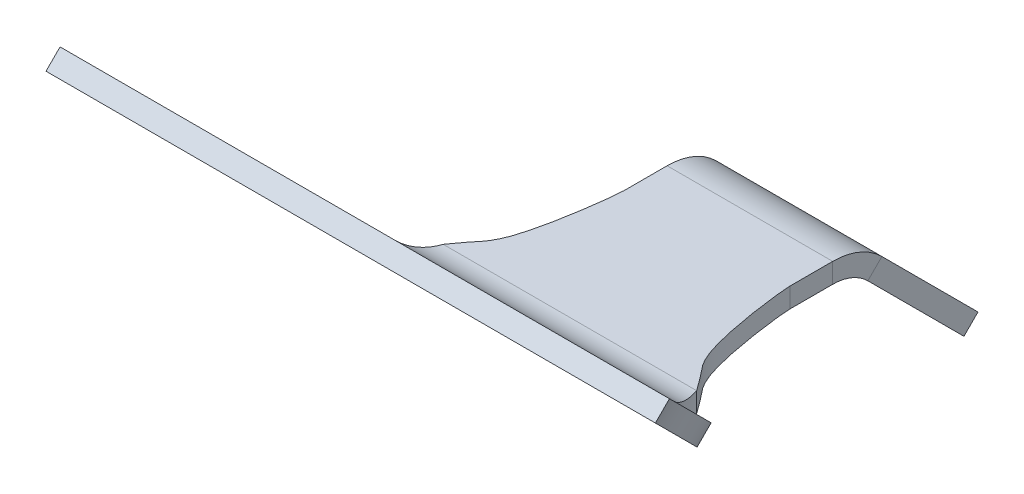
ISO-10303-21;
HEADER;
FILE_DESCRIPTION(('STEP AP214'),'2;1');
FILE_NAME('part.step','',(''),(''),'','','');
FILE_SCHEMA(('AUTOMOTIVE_DESIGN { 1 0 10303 214 1 1 1 1 }'));
ENDSEC;
DATA;
#1=APPLICATION_CONTEXT('core data for automotive mechanical design processes');
#2=APPLICATION_PROTOCOL_DEFINITION('international standard','automotive_design',2000,#1);
#3=PRODUCT_CONTEXT('',#1,'mechanical');
#4=PRODUCT('Part','Part','',(#3));
#5=PRODUCT_RELATED_PRODUCT_CATEGORY('part','',(#4));
#6=PRODUCT_DEFINITION_FORMATION('','',#4);
#7=PRODUCT_DEFINITION_CONTEXT('part definition',#1,'design');
#8=PRODUCT_DEFINITION('design','',#6,#7);
#9=PRODUCT_DEFINITION_SHAPE('','',#8);
#10=(LENGTH_UNIT() NAMED_UNIT(*) SI_UNIT(.MILLI.,.METRE.));
#11=(NAMED_UNIT(*) PLANE_ANGLE_UNIT() SI_UNIT($,.RADIAN.));
#12=(NAMED_UNIT(*) SI_UNIT($,.STERADIAN.) SOLID_ANGLE_UNIT());
#13=UNCERTAINTY_MEASURE_WITH_UNIT(LENGTH_MEASURE(1.E-05),#10,'distance_accuracy_value','');
#14=(GEOMETRIC_REPRESENTATION_CONTEXT(3) GLOBAL_UNCERTAINTY_ASSIGNED_CONTEXT((#13)) GLOBAL_UNIT_ASSIGNED_CONTEXT((#10,
#11,#12)) REPRESENTATION_CONTEXT('',''));
#15=CARTESIAN_POINT('',(0.,0.,0.));
#16=DIRECTION('',(0.,0.,1.));
#17=DIRECTION('',(1.,0.,0.));
#18=AXIS2_PLACEMENT_3D('',#15,#16,#17);
#19=CARTESIAN_POINT('',(12.5,15.1311802483163,-12.6305469640361));
#20=DIRECTION('',(1.,0.,0.));
#21=DIRECTION('',(0.,0.,1.));
#22=AXIS2_PLACEMENT_3D('',#19,#20,#21);
#23=PLANE('',#22);
#24=DIRECTION('',(0.,0.,1.));
#25=VECTOR('',#24,1.);
#26=CARTESIAN_POINT('',(12.5,12.1311802483163,-12.6305469640361));
#27=LINE('',#26,#25);
#28=CARTESIAN_POINT('',(12.5,12.1311802483163,-19.1098316195848));
#29=VERTEX_POINT('',#28);
#30=CARTESIAN_POINT('',(12.5,12.1311802483163,-12.6305469640361));
#31=VERTEX_POINT('',#30);
#32=EDGE_CURVE('E193',#29,#31,#27,.T.);
#33=ORIENTED_EDGE('',*,*,#32,.F.);
#34=DIRECTION('',(0.,1.,0.));
#35=VECTOR('',#34,1.);
#36=CARTESIAN_POINT('',(12.5,15.1311802483163,-19.1098316195848));
#37=LINE('',#36,#35);
#38=CARTESIAN_POINT('',(12.5,15.1311802483163,-19.1098316195847));
#39=VERTEX_POINT('',#38);
#40=EDGE_CURVE('E171',#29,#39,#37,.T.);
#41=ORIENTED_EDGE('',*,*,#40,.T.);
#42=DIRECTION('',(0.,0.,1.));
#43=VECTOR('',#42,1.);
#44=CARTESIAN_POINT('',(12.5,15.1311802483163,-12.6305469640361));
#45=LINE('',#44,#43);
#46=CARTESIAN_POINT('',(12.5,15.1311802483163,-12.6305469640361));
#47=VERTEX_POINT('',#46);
#48=EDGE_CURVE('E63',#39,#47,#45,.T.);
#49=ORIENTED_EDGE('',*,*,#48,.T.);
#50=DIRECTION('',(0.,-1.,0.));
#51=VECTOR('',#50,1.);
#52=CARTESIAN_POINT('',(12.5,15.1311802483163,-12.6305469640361));
#53=LINE('',#52,#51);
#54=EDGE_CURVE('E201',#47,#31,#53,.T.);
#55=ORIENTED_EDGE('',*,*,#54,.T.);
#56=EDGE_LOOP('',(#33,#41,#49,#55));
#57=FACE_BOUND('',#56,.T.);
#58=ADVANCED_FACE('F59',(#57),#23,.T.);
#59=CARTESIAN_POINT('',(-12.5,15.1311802483163,-12.6305469640361));
#60=DIRECTION('',(-1.,0.,0.));
#61=DIRECTION('',(0.,0.,-1.));
#62=AXIS2_PLACEMENT_3D('',#59,#60,#61);
#63=PLANE('',#62);
#64=DIRECTION('',(0.,0.,-1.));
#65=VECTOR('',#64,1.);
#66=CARTESIAN_POINT('',(-12.5,15.1311802483163,-12.6305469640361));
#67=LINE('',#66,#65);
#68=CARTESIAN_POINT('',(-12.5,15.1311802483163,-12.6305469640361));
#69=VERTEX_POINT('',#68);
#70=CARTESIAN_POINT('',(-12.5,15.1311802483163,-19.1098316195848));
#71=VERTEX_POINT('',#70);
#72=EDGE_CURVE('E199',#69,#71,#67,.T.);
#73=ORIENTED_EDGE('',*,*,#72,.T.);
#74=DIRECTION('',(0.,-1.,0.));
#75=VECTOR('',#74,1.);
#76=CARTESIAN_POINT('',(-12.5,15.1311802483163,-19.1098316195848));
#77=LINE('',#76,#75);
#78=CARTESIAN_POINT('',(-12.5,12.1311802483163,-19.1098316195848));
#79=VERTEX_POINT('',#78);
#80=EDGE_CURVE('E12',#71,#79,#77,.T.);
#81=ORIENTED_EDGE('',*,*,#80,.T.);
#82=DIRECTION('',(0.,0.,-1.));
#83=VECTOR('',#82,1.);
#84=CARTESIAN_POINT('',(-12.5,12.1311802483163,-12.6305469640361));
#85=LINE('',#84,#83);
#86=CARTESIAN_POINT('',(-12.5,12.1311802483163,-12.6305469640361));
#87=VERTEX_POINT('',#86);
#88=EDGE_CURVE('E191',#87,#79,#85,.T.);
#89=ORIENTED_EDGE('',*,*,#88,.F.);
#90=DIRECTION('',(0.,-1.,0.));
#91=VECTOR('',#90,1.);
#92=CARTESIAN_POINT('',(-12.5,15.1311802483163,-12.6305469640361));
#93=LINE('',#92,#91);
#94=EDGE_CURVE('E334',#69,#87,#93,.T.);
#95=ORIENTED_EDGE('',*,*,#94,.F.);
#96=EDGE_LOOP('',(#73,#81,#89,#95));
#97=FACE_BOUND('',#96,.T.);
#98=ADVANCED_FACE('F61',(#97),#63,.T.);
#99=CARTESIAN_POINT('',(-27.660317627681,15.1311802483161,20.0813559891));
#100=DIRECTION('',(0.,1.,0.));
#101=DIRECTION('',(-1.,0.,0.));
#102=AXIS2_PLACEMENT_3D('',#99,#100,#101);
#103=PLANE('',#102);
#104=ORIENTED_EDGE('',*,*,#48,.F.);
#105=DIRECTION('',(-1.,0.,0.));
#106=VECTOR('',#105,1.);
#107=CARTESIAN_POINT('',(-27.660317627681,15.1311802483163,-19.1098316195848));
#108=LINE('',#107,#106);
#109=EDGE_CURVE('E163',#39,#71,#108,.T.);
#110=ORIENTED_EDGE('',*,*,#109,.T.);
#111=ORIENTED_EDGE('',*,*,#72,.F.);
#112=CARTESIAN_POINT('',(-46.,15.131180248316,47.369453035964));
#113=CARTESIAN_POINT('',(-41.2195604310823,15.131180248316,38.5307724819687));
#114=CARTESIAN_POINT('',(-41.5910175016558,15.1311802483161,26.9984495535955));
#115=CARTESIAN_POINT('',(-25.7021633373936,15.1311802483161,21.4414873090519));
#116=CARTESIAN_POINT('',(-21.2965224131741,15.1311802483162,9.74072410555167));
#117=CARTESIAN_POINT('',(-14.2557252648445,15.1311802483162,2.2860798987868));
#118=CARTESIAN_POINT('',(-12.5756166060138,15.1311802483163,-10.264528004786));
#119=CARTESIAN_POINT('',(-12.5,15.1311802483163,-12.6305469640361));
#120=B_SPLINE_CURVE_WITH_KNOTS('',3,(#112,#113,#114,#115,#116,#117,#118,#119),.UNSPECIFIED.,.F.,
.F.,(4,1,1,1,1,4),(0.,0.326235686639177,0.410817953526189,0.797488811609687,0.861240401983112,
1.),.UNSPECIFIED.);
#121=CARTESIAN_POINT('',(-19.1339481414061,15.1311802414496,8.06630903878126));
#122=VERTEX_POINT('',#121);
#123=EDGE_CURVE('E202',#122,#69,#120,.T.);
#124=ORIENTED_EDGE('',*,*,#123,.F.);
#125=DIRECTION('',(-1.,0.,0.));
#126=VECTOR('',#125,1.);
#127=CARTESIAN_POINT('',(-27.660317627681,15.1311802483162,8.06630901686981));
#128=LINE('',#127,#126);
#129=CARTESIAN_POINT('',(19.1339481414307,15.1311802483162,8.0663090266165));
#130=VERTEX_POINT('',#129);
#131=EDGE_CURVE('E330',#130,#122,#128,.T.);
#132=ORIENTED_EDGE('',*,*,#131,.F.);
#133=CARTESIAN_POINT('',(12.5,15.1311802483163,-12.6305469640361));
#134=CARTESIAN_POINT('',(12.5756166060138,15.1311802483163,-10.264528004786));
#135=CARTESIAN_POINT('',(14.2557252648445,15.1311802483162,2.2860798987868));
#136=CARTESIAN_POINT('',(21.2965224131741,15.1311802483162,9.74072410555167));
#137=CARTESIAN_POINT('',(25.7021633373936,15.1311802483161,21.4414873090519));
#138=CARTESIAN_POINT('',(41.5910175016558,15.1311802483161,26.9984495535955));
#139=CARTESIAN_POINT('',(41.2195604310823,15.131180248316,38.5307724819687));
#140=CARTESIAN_POINT('',(46.,15.131180248316,47.369453035964));
#141=B_SPLINE_CURVE_WITH_KNOTS('',3,(#133,#134,#135,#136,#137,#138,#139,#140),.UNSPECIFIED.,.F.,
.F.,(4,1,1,1,1,4),(0.,0.138759598016888,0.202511188390313,0.589182046473811,0.673764313360823,
1.),.UNSPECIFIED.);
#142=EDGE_CURVE('E187',#47,#130,#141,.T.);
#143=ORIENTED_EDGE('',*,*,#142,.F.);
#144=EDGE_LOOP('',(#104,#110,#111,#124,#132,#143));
#145=FACE_BOUND('',#144,.T.);
#146=ADVANCED_FACE('F185',(#145),#103,.T.);
#147=CARTESIAN_POINT('',(-27.660317627681,12.1311802483161,20.0813559890999));
#148=DIRECTION('',(0.,1.,0.));
#149=DIRECTION('',(-1.,0.,0.));
#150=AXIS2_PLACEMENT_3D('',#147,#148,#149);
#151=PLANE('',#150);
#152=DIRECTION('',(-1.,0.,0.));
#153=VECTOR('',#152,1.);
#154=CARTESIAN_POINT('',(-27.660317627681,12.1311802483163,-19.1098316195848));
#155=LINE('',#154,#153);
#156=EDGE_CURVE('E68',#29,#79,#155,.T.);
#157=ORIENTED_EDGE('',*,*,#156,.F.);
#158=ORIENTED_EDGE('',*,*,#32,.T.);
#159=CARTESIAN_POINT('',(12.5,12.1311802483163,-12.6305469640361));
#160=CARTESIAN_POINT('',(12.5756166060138,12.1311802483163,-10.264528004786));
#161=CARTESIAN_POINT('',(14.2557252648445,12.1311802483162,2.28607989878678));
#162=CARTESIAN_POINT('',(21.2965224131741,12.1311802483162,9.74072410555166));
#163=CARTESIAN_POINT('',(25.7021633373936,12.1311802483161,21.4414873090518));
#164=CARTESIAN_POINT('',(41.5910175016558,12.1311802483161,26.9984495535955));
#165=CARTESIAN_POINT('',(41.2195604310823,12.131180248316,38.5307724819687));
#166=CARTESIAN_POINT('',(46.,12.131180248316,47.369453035964));
#167=B_SPLINE_CURVE_WITH_KNOTS('',3,(#159,#160,#161,#162,#163,#164,#165,#166),.UNSPECIFIED.,.F.,
.F.,(4,1,1,1,1,4),(0.,0.138759598016888,0.202511188390313,0.589182046473811,0.673764313360823,
1.),.UNSPECIFIED.);
#168=CARTESIAN_POINT('',(19.1339481414307,12.1311802483162,8.06630902661649));
#169=VERTEX_POINT('',#168);
#170=EDGE_CURVE('E84',#31,#169,#167,.T.);
#171=ORIENTED_EDGE('',*,*,#170,.T.);
#172=DIRECTION('',(-1.,0.,0.));
#173=VECTOR('',#172,1.);
#174=CARTESIAN_POINT('',(-27.660317627681,12.1311802483162,8.06630901686979));
#175=LINE('',#174,#173);
#176=CARTESIAN_POINT('',(-19.1339481414061,12.1311802483162,8.06630902658065));
#177=VERTEX_POINT('',#176);
#178=EDGE_CURVE('E345',#169,#177,#175,.T.);
#179=ORIENTED_EDGE('',*,*,#178,.T.);
#180=CARTESIAN_POINT('',(-46.,12.131180248316,47.369453035964));
#181=CARTESIAN_POINT('',(-41.2195604310823,12.131180248316,38.5307724819687));
#182=CARTESIAN_POINT('',(-41.5910175016558,12.1311802483161,26.9984495535954));
#183=CARTESIAN_POINT('',(-25.7021633373936,12.1311802483161,21.4414873090518));
#184=CARTESIAN_POINT('',(-21.2965224131741,12.1311802483162,9.74072410555166));
#185=CARTESIAN_POINT('',(-14.2557252648445,12.1311802483162,2.28607989878679));
#186=CARTESIAN_POINT('',(-12.5756166060138,12.1311802483163,-10.264528004786));
#187=CARTESIAN_POINT('',(-12.5,12.1311802483163,-12.6305469640361));
#188=B_SPLINE_CURVE_WITH_KNOTS('',3,(#180,#181,#182,#183,#184,#185,#186,#187),.UNSPECIFIED.,.F.,
.F.,(4,1,1,1,1,4),(0.,0.326235686639177,0.410817953526189,0.797488811609687,0.861240401983112,
1.),.UNSPECIFIED.);
#189=EDGE_CURVE('E204',#177,#87,#188,.T.);
#190=ORIENTED_EDGE('',*,*,#189,.T.);
#191=ORIENTED_EDGE('',*,*,#88,.T.);
#192=EDGE_LOOP('',(#157,#158,#171,#179,#190,#191));
#193=FACE_BOUND('',#192,.T.);
#194=ADVANCED_FACE('F311',(#193),#151,.F.);
#195=DIRECTION('',(0.,-1.,0.));
#196=VECTOR('',#195,1.);
#197=SURFACE_OF_LINEAR_EXTRUSION('',#120,#196);
#198=CARTESIAN_POINT('',(-19.1339481414061,15.1311802414496,8.06630903878128));
#199=CARTESIAN_POINT('',(-19.1339481414061,12.1311802414496,8.06630904640816));
#200=B_SPLINE_CURVE_WITH_KNOTS('',1,(#198,#199),.UNSPECIFIED.,.F.,.F.,(2,2),(0.,1.),.UNSPECIFIED.);
#201=EDGE_CURVE('E333',#122,#177,#200,.T.);
#202=ORIENTED_EDGE('',*,*,#201,.F.);
#203=ORIENTED_EDGE('',*,*,#123,.T.);
#204=ORIENTED_EDGE('',*,*,#94,.T.);
#205=ORIENTED_EDGE('',*,*,#189,.F.);
#206=EDGE_LOOP('',(#202,#203,#204,#205));
#207=FACE_BOUND('',#206,.T.);
#208=ADVANCED_FACE('F305',(#207),#197,.T.);
#209=DIRECTION('',(0.,-1.,0.));
#210=VECTOR('',#209,1.);
#211=SURFACE_OF_LINEAR_EXTRUSION('',#141,#210);
#212=CARTESIAN_POINT('',(19.1339481414307,12.1311802414496,8.06630904650663));
#213=CARTESIAN_POINT('',(19.1339481414307,15.1311802414496,8.06630903885162));
#214=B_SPLINE_CURVE_WITH_KNOTS('',1,(#212,#213),.UNSPECIFIED.,.F.,.F.,(2,2),(0.,1.),.UNSPECIFIED.);
#215=EDGE_CURVE('E172',#169,#130,#214,.T.);
#216=ORIENTED_EDGE('',*,*,#215,.F.);
#217=ORIENTED_EDGE('',*,*,#170,.F.);
#218=ORIENTED_EDGE('',*,*,#54,.F.);
#219=ORIENTED_EDGE('',*,*,#142,.T.);
#220=EDGE_LOOP('',(#216,#217,#218,#219));
#221=FACE_BOUND('',#220,.T.);
#222=ADVANCED_FACE('F310',(#221),#211,.T.);
#223=CARTESIAN_POINT('',(46.,42.9980786968436,39.0398091929065));
#224=DIRECTION('',(0.,0.707106781186546,0.707106781186549));
#225=DIRECTION('',(-1.,0.,0.));
#226=AXIS2_PLACEMENT_3D('',#223,#224,#225);
#227=PLANE('',#226);
#228=DIRECTION('',(-1.,0.,0.));
#229=VECTOR('',#228,1.);
#230=CARTESIAN_POINT('',(46.,40.876758353284,41.1611295364661));
#231=LINE('',#230,#229);
#232=CARTESIAN_POINT('',(46.,40.876758353284,41.1611295364661));
#233=VERTEX_POINT('',#232);
#234=CARTESIAN_POINT('',(-46.,40.8767583532841,41.1611295364662));
#235=VERTEX_POINT('',#234);
#236=EDGE_CURVE('E222',#233,#235,#231,.T.);
#237=ORIENTED_EDGE('',*,*,#236,.F.);
#238=DIRECTION('',(0.,-0.707106781186549,0.707106781186546));
#239=VECTOR('',#238,1.);
#240=CARTESIAN_POINT('',(46.,42.9980786968436,39.0398091929065));
#241=LINE('',#240,#239);
#242=CARTESIAN_POINT('',(46.,42.9980786968436,39.0398091929065));
#243=VERTEX_POINT('',#242);
#244=EDGE_CURVE('E205',#243,#233,#241,.T.);
#245=ORIENTED_EDGE('',*,*,#244,.F.);
#246=DIRECTION('',(-1.,0.,0.));
#247=VECTOR('',#246,1.);
#248=CARTESIAN_POINT('',(46.,42.9980786968436,39.0398091929065));
#249=LINE('',#248,#247);
#250=CARTESIAN_POINT('',(-46.,42.9980786968437,39.0398091929066));
#251=VERTEX_POINT('',#250);
#252=EDGE_CURVE('E230',#243,#251,#249,.T.);
#253=ORIENTED_EDGE('',*,*,#252,.T.);
#254=DIRECTION('',(0.,-0.707106781186549,0.707106781186546));
#255=VECTOR('',#254,1.);
#256=CARTESIAN_POINT('',(-46.,42.9980786968437,39.0398091929066));
#257=LINE('',#256,#255);
#258=EDGE_CURVE('E227',#251,#235,#257,.T.);
#259=ORIENTED_EDGE('',*,*,#258,.T.);
#260=EDGE_LOOP('',(#237,#245,#253,#259));
#261=FACE_BOUND('',#260,.T.);
#262=ADVANCED_FACE('F418',(#261),#227,.T.);
#263=CARTESIAN_POINT('',(-27.660317627681,23.7024802293296,19.7442107253924));
#264=DIRECTION('',(0.,0.707106781186549,-0.707106781186546));
#265=DIRECTION('',(-1.,0.,0.));
#266=AXIS2_PLACEMENT_3D('',#263,#264,#265);
#267=PLANE('',#266);
#268=CARTESIAN_POINT('',(12.5,0.571671825650955,-3.3865976782864));
#269=CARTESIAN_POINT('',(12.5756166060138,2.24469987615263,-1.71356962778471));
#270=CARTESIAN_POINT('',(14.2557252648445,11.1193198327824,7.16105032884509));
#271=CARTESIAN_POINT('',(21.2965224131741,16.3905493027188,12.4322797987816));
#272=CARTESIAN_POINT('',(25.7021633373936,24.6642383089718,20.7059688050346));
#273=CARTESIAN_POINT('',(41.5910175016558,28.5936039948862,24.635334490949));
#274=CARTESIAN_POINT('',(41.2195604310823,36.748187740372,32.7899182364348));
#275=CARTESIAN_POINT('',(46.,42.9980786968437,39.0398091929066));
#276=B_SPLINE_CURVE_WITH_KNOTS('',3,(#268,#269,#270,#271,#272,#273,#274,#275),.UNSPECIFIED.,.F.,
.F.,(4,1,1,1,1,4),(0.,0.138759598016888,0.202511188390313,0.589182046473811,0.673764313360823,
1.),.UNSPECIFIED.);
#277=CARTESIAN_POINT('',(21.0887316402293,17.3278793825504,13.3696098786132));
#278=VERTEX_POINT('',#277);
#279=EDGE_CURVE('E208',#278,#243,#276,.T.);
#280=ORIENTED_EDGE('',*,*,#279,.F.);
#281=DIRECTION('',(-1.,0.,0.));
#282=VECTOR('',#281,1.);
#283=CARTESIAN_POINT('',(-27.660317627681,17.3278793825505,13.3696098786132));
#284=LINE('',#283,#282);
#285=CARTESIAN_POINT('',(-21.0887316402293,17.3278793825505,13.3696098786132));
#286=VERTEX_POINT('',#285);
#287=EDGE_CURVE('E229',#278,#286,#284,.T.);
#288=ORIENTED_EDGE('',*,*,#287,.T.);
#289=CARTESIAN_POINT('',(-46.,42.9980786968437,39.0398091929066));
#290=CARTESIAN_POINT('',(-41.2195604310823,36.748187740372,32.7899182364348));
#291=CARTESIAN_POINT('',(-41.5910175016558,28.5936039948862,24.635334490949));
#292=CARTESIAN_POINT('',(-25.7021633373936,24.6642383089718,20.7059688050346));
#293=CARTESIAN_POINT('',(-21.2965224131741,16.3905493027188,12.4322797987816));
#294=CARTESIAN_POINT('',(-14.2557252648445,11.1193198327824,7.16105032884509));
#295=CARTESIAN_POINT('',(-12.5756166060138,2.24469987615263,-1.71356962778471));
#296=CARTESIAN_POINT('',(-12.5,0.571671825650955,-3.3865976782864));
#297=B_SPLINE_CURVE_WITH_KNOTS('',3,(#289,#290,#291,#292,#293,#294,#295,#296),.UNSPECIFIED.,.F.,
.F.,(4,1,1,1,1,4),(0.,0.326235686639177,0.410817953526189,0.797488811609687,0.861240401983112,
1.),.UNSPECIFIED.);
#298=EDGE_CURVE('E286',#251,#286,#297,.T.);
#299=ORIENTED_EDGE('',*,*,#298,.F.);
#300=ORIENTED_EDGE('',*,*,#252,.F.);
#301=EDGE_LOOP('',(#280,#288,#299,#300));
#302=FACE_BOUND('',#301,.T.);
#303=ADVANCED_FACE('F270',(#302),#267,.T.);
#304=DIRECTION('',(0.,-0.707106781186549,0.707106781186546));
#305=VECTOR('',#304,1.);
#306=SURFACE_OF_LINEAR_EXTRUSION('',#297,#305);
#307=ORIENTED_EDGE('',*,*,#298,.T.);
#308=CARTESIAN_POINT('',(-21.0887316402293,17.3278793825505,13.3696098786132));
#309=DIRECTION('',(0.,-0.707106781186549,0.707106781186546));
#310=VECTOR('',#309,1.);
#311=LINE('',#308,#310);
#312=CARTESIAN_POINT('',(-21.0887316389967,15.206559037611,15.490930220793));
#313=VERTEX_POINT('',#312);
#314=EDGE_CURVE('E253',#286,#313,#311,.T.);
#315=ORIENTED_EDGE('',*,*,#314,.T.);
#316=CARTESIAN_POINT('',(-46.,40.8767583532841,41.1611295364662));
#317=CARTESIAN_POINT('',(-41.2195604310823,34.6268673968124,34.9112385799945));
#318=CARTESIAN_POINT('',(-41.5910175016558,26.4722836513266,26.7566548345086));
#319=CARTESIAN_POINT('',(-25.7021633373936,22.5429179654122,22.8272891485942));
#320=CARTESIAN_POINT('',(-21.2965224131741,14.2692289591592,14.5536001423412));
#321=CARTESIAN_POINT('',(-14.2557252648445,8.99799948922275,9.28237067240473));
#322=CARTESIAN_POINT('',(-12.5756166060138,0.123379532592985,0.407750715774927));
#323=CARTESIAN_POINT('',(-12.5,-1.54964851790869,-1.26527733472676));
#324=B_SPLINE_CURVE_WITH_KNOTS('',3,(#316,#317,#318,#319,#320,#321,#322,#323),.UNSPECIFIED.,.F.,
.F.,(4,1,1,1,1,4),(0.,0.326235686639177,0.410817953526189,0.797488811609687,0.861240401983112,
1.),.UNSPECIFIED.);
#325=EDGE_CURVE('E225',#235,#313,#324,.T.);
#326=ORIENTED_EDGE('',*,*,#325,.F.);
#327=ORIENTED_EDGE('',*,*,#258,.F.);
#328=EDGE_LOOP('',(#307,#315,#326,#327));
#329=FACE_BOUND('',#328,.T.);
#330=ADVANCED_FACE('F259',(#329),#306,.T.);
#331=CARTESIAN_POINT('',(-27.660317627681,21.58115988577,21.865531068952));
#332=DIRECTION('',(0.,0.707106781186549,-0.707106781186546));
#333=DIRECTION('',(-1.,0.,0.));
#334=AXIS2_PLACEMENT_3D('',#331,#332,#333);
#335=PLANE('',#334);
#336=DIRECTION('',(-1.,0.,0.));
#337=VECTOR('',#336,1.);
#338=CARTESIAN_POINT('',(-27.660317627681,15.2065590389908,15.4909302221728));
#339=LINE('',#338,#337);
#340=CARTESIAN_POINT('',(21.0887316402293,15.2065590389908,15.4909302221728));
#341=VERTEX_POINT('',#340);
#342=EDGE_CURVE('E233',#341,#313,#339,.T.);
#343=ORIENTED_EDGE('',*,*,#342,.F.);
#344=CARTESIAN_POINT('',(12.5,-1.54964851790869,-1.26527733472676));
#345=CARTESIAN_POINT('',(12.5756166060138,0.123379532592985,0.407750715774927));
#346=CARTESIAN_POINT('',(14.2557252648445,8.99799948922275,9.28237067240473));
#347=CARTESIAN_POINT('',(21.2965224131741,14.2692289591592,14.5536001423412));
#348=CARTESIAN_POINT('',(25.7021633373936,22.5429179654122,22.8272891485942));
#349=CARTESIAN_POINT('',(41.5910175016558,26.4722836513266,26.7566548345086));
#350=CARTESIAN_POINT('',(41.2195604310823,34.6268673968124,34.9112385799945));
#351=CARTESIAN_POINT('',(46.,40.8767583532841,41.1611295364662));
#352=B_SPLINE_CURVE_WITH_KNOTS('',3,(#344,#345,#346,#347,#348,#349,#350,#351),.UNSPECIFIED.,.F.,
.F.,(4,1,1,1,1,4),(0.,0.138759598016888,0.202511188390313,0.589182046473811,0.673764313360823,
1.),.UNSPECIFIED.);
#353=EDGE_CURVE('E226',#341,#233,#352,.T.);
#354=ORIENTED_EDGE('',*,*,#353,.T.);
#355=ORIENTED_EDGE('',*,*,#236,.T.);
#356=ORIENTED_EDGE('',*,*,#325,.T.);
#357=EDGE_LOOP('',(#343,#354,#355,#356));
#358=FACE_BOUND('',#357,.T.);
#359=ADVANCED_FACE('F269',(#358),#335,.F.);
#360=DIRECTION('',(0.,-0.707106781186549,0.707106781186546));
#361=VECTOR('',#360,1.);
#362=SURFACE_OF_LINEAR_EXTRUSION('',#276,#361);
#363=ORIENTED_EDGE('',*,*,#353,.F.);
#364=CARTESIAN_POINT('',(21.0887316402293,15.2065590389908,15.4909302221728));
#365=DIRECTION('',(0.,0.707106781186549,-0.707106781186545));
#366=VECTOR('',#365,1.);
#367=LINE('',#364,#366);
#368=EDGE_CURVE('E214',#341,#278,#367,.T.);
#369=ORIENTED_EDGE('',*,*,#368,.T.);
#370=ORIENTED_EDGE('',*,*,#279,.T.);
#371=ORIENTED_EDGE('',*,*,#244,.T.);
#372=EDGE_LOOP('',(#363,#369,#370,#371));
#373=FACE_BOUND('',#372,.T.);
#374=ADVANCED_FACE('F295',(#373),#362,.T.);
#375=CARTESIAN_POINT('',(21.0887316402293,15.2065590389908,15.4909302221728));
#376=CARTESIAN_POINT('',(20.7628787749621,14.2345124938019,14.518883676984));
#377=CARTESIAN_POINT('',(20.4371371406298,13.4564231687676,13.3543083211885));
#378=CARTESIAN_POINT('',(19.7855426410302,12.4044671416475,10.8146618226596));
#379=CARTESIAN_POINT('',(19.459801006698,12.1311802449573,9.44099045397059));
#380=CARTESIAN_POINT('',(19.1339481414307,12.1311802414496,8.06630904650663));
#381=CARTESIAN_POINT('',(21.0887316402293,17.3278793825505,13.3696098786132));
#382=CARTESIAN_POINT('',(20.7628814772586,16.6335661796857,12.6752966757484));
#383=CARTESIAN_POINT('',(20.4371371406298,16.077782332391,11.8434513779101));
#384=CARTESIAN_POINT('',(19.7855426410302,15.3263851701624,10.0294181646752));
#385=CARTESIAN_POINT('',(19.4597983044014,15.1311802439551,9.0482161868776));
#386=CARTESIAN_POINT('',(19.1339481414307,15.1311802414496,8.06630903885162));
#387=B_SPLINE_SURFACE_WITH_KNOTS('',1,3,((#375,#376,#377,#378,#379,#380),(#381,#382,#383,#384,
#385,#386)),.UNSPECIFIED.,.F.,.F.,.F.,(2,2),(4,2,4),(0.,1.),(0.,0.5,1.),.UNSPECIFIED.);
#388=CARTESIAN_POINT('',(21.0887316402293,15.2065590389908,15.4909302221728));
#389=CARTESIAN_POINT('',(20.7628787749621,14.2345124938019,14.518883676984));
#390=CARTESIAN_POINT('',(20.4371371406298,13.4564231687676,13.3543083211885));
#391=CARTESIAN_POINT('',(19.7855426410302,12.4044671416475,10.8146618226596));
#392=CARTESIAN_POINT('',(19.459801006698,12.1311802449573,9.44099045397059));
#393=CARTESIAN_POINT('',(19.1339481414307,12.1311802414496,8.06630904650663));
#394=B_SPLINE_CURVE_WITH_KNOTS('',3,(#388,#389,#390,#391,#392,#393),.UNSPECIFIED.,.F.,.F.,(4,2,
4),(0.,0.5,1.),.UNSPECIFIED.);
#395=EDGE_CURVE('E460',#341,#169,#394,.T.);
#396=CARTESIAN_POINT('',(19.1339481414307,15.1311802414496,8.06630903885162));
#397=CARTESIAN_POINT('',(19.4597983044014,15.1311802439551,9.0482161868776));
#398=CARTESIAN_POINT('',(19.7855426410302,15.3263851701624,10.0294181646752));
#399=CARTESIAN_POINT('',(20.4371371406298,16.077782332391,11.8434513779101));
#400=CARTESIAN_POINT('',(20.7628814772586,16.6335661796857,12.6752966757484));
#401=CARTESIAN_POINT('',(21.0887316402293,17.3278793825505,13.3696098786132));
#402=B_SPLINE_CURVE_WITH_KNOTS('',3,(#396,#397,#398,#399,#400,#401),.UNSPECIFIED.,.F.,.F.,(4,2,
4),(0.,0.5,1.),.UNSPECIFIED.);
#403=EDGE_CURVE('E390',#278,#130,#402,.F.);
#404=ORIENTED_EDGE('',*,*,#368,.F.);
#405=ORIENTED_EDGE('',*,*,#395,.T.);
#406=ORIENTED_EDGE('',*,*,#215,.T.);
#407=ORIENTED_EDGE('',*,*,#403,.F.);
#408=EDGE_LOOP('',(#404,#405,#406,#407));
#409=FACE_BOUND('',#408,.T.);
#410=ADVANCED_FACE('F304',(#409),#387,.F.);
#411=CARTESIAN_POINT('',(-19.1339481414061,12.1311802414496,8.06630904640816));
#412=CARTESIAN_POINT('',(-19.4598010066774,12.1311802449444,9.44099045388855));
#413=CARTESIAN_POINT('',(-19.7855426410138,12.4044671416284,10.8146618225965));
#414=CARTESIAN_POINT('',(-20.4371371406216,13.4564231687491,13.3543083211606));
#415=CARTESIAN_POINT('',(-20.762878774958,14.2345124937903,14.5188836769724));
#416=CARTESIAN_POINT('',(-21.0887316402293,15.2065590389908,15.4909302221728));
#417=CARTESIAN_POINT('',(-19.1339481414061,15.1311802414496,8.06630903878128));
#418=CARTESIAN_POINT('',(-19.4597983043809,15.1311802439459,9.04821618681896));
#419=CARTESIAN_POINT('',(-19.7855426410138,15.3263851701487,10.0294181646301));
#420=CARTESIAN_POINT('',(-20.4371371406216,16.0777823323778,11.8434513778902));
#421=CARTESIAN_POINT('',(-20.7628814772545,16.6335661796775,12.6752966757402));
#422=CARTESIAN_POINT('',(-21.0887316402293,17.3278793825505,13.3696098786132));
#423=B_SPLINE_SURFACE_WITH_KNOTS('',1,3,((#411,#412,#413,#414,#415,#416),(#417,#418,#419,#420,
#421,#422)),.UNSPECIFIED.,.F.,.F.,.F.,(2,2),(4,2,4),(0.,1.),(0.,0.5,1.),.UNSPECIFIED.);
#424=CARTESIAN_POINT('',(-19.1339481414061,12.1311802414496,8.06630904640816));
#425=CARTESIAN_POINT('',(-19.4598010066774,12.1311802449444,9.44099045388855));
#426=CARTESIAN_POINT('',(-19.7855426410138,12.4044671416284,10.8146618225965));
#427=CARTESIAN_POINT('',(-20.4371371406216,13.4564231687491,13.3543083211606));
#428=CARTESIAN_POINT('',(-20.762878774958,14.2345124937903,14.5188836769724));
#429=CARTESIAN_POINT('',(-21.0887316402293,15.2065590389908,15.4909302221728));
#430=B_SPLINE_CURVE_WITH_KNOTS('',3,(#424,#425,#426,#427,#428,#429),.UNSPECIFIED.,.F.,.F.,(4,2,
4),(0.,0.5,1.),.UNSPECIFIED.);
#431=EDGE_CURVE('E464',#177,#313,#430,.T.);
#432=CARTESIAN_POINT('',(-21.0887316402293,17.3278793825505,13.3696098786132));
#433=CARTESIAN_POINT('',(-20.7628814772545,16.6335661796775,12.6752966757402));
#434=CARTESIAN_POINT('',(-20.4371371406216,16.0777823323778,11.8434513778902));
#435=CARTESIAN_POINT('',(-19.7855426410138,15.3263851701487,10.0294181646301));
#436=CARTESIAN_POINT('',(-19.4597983043809,15.1311802439459,9.04821618681896));
#437=CARTESIAN_POINT('',(-19.1339481414061,15.1311802414496,8.06630903878128));
#438=B_SPLINE_CURVE_WITH_KNOTS('',3,(#432,#433,#434,#435,#436,#437),.UNSPECIFIED.,.F.,.F.,(4,2,
4),(0.,0.5,1.),.UNSPECIFIED.);
#439=EDGE_CURVE('E236',#122,#286,#438,.F.);
#440=ORIENTED_EDGE('',*,*,#431,.T.);
#441=ORIENTED_EDGE('',*,*,#314,.F.);
#442=ORIENTED_EDGE('',*,*,#439,.F.);
#443=ORIENTED_EDGE('',*,*,#201,.T.);
#444=EDGE_LOOP('',(#440,#441,#442,#443));
#445=FACE_BOUND('',#444,.T.);
#446=ADVANCED_FACE('F393',(#445),#423,.F.);
#447=CARTESIAN_POINT('',(42.3903103163467,22.6311802414496,8.06630901971409));
#448=DIRECTION('',(-1.,0.,0.));
#449=DIRECTION('',(0.,-0.707106781186549,0.707106781186546));
#450=AXIS2_PLACEMENT_3D('',#447,#448,#449);
#451=CYLINDRICAL_SURFACE('',#450,7.5);
#452=ORIENTED_EDGE('',*,*,#131,.T.);
#453=ORIENTED_EDGE('',*,*,#439,.T.);
#454=ORIENTED_EDGE('',*,*,#287,.F.);
#455=ORIENTED_EDGE('',*,*,#403,.T.);
#456=EDGE_LOOP('',(#452,#453,#454,#455));
#457=FACE_BOUND('',#456,.T.);
#458=ADVANCED_FACE('F386',(#457),#451,.F.);
#459=CARTESIAN_POINT('',(42.3903103163467,22.6311802414496,8.06630901971409));
#460=DIRECTION('',(-1.,0.,0.));
#461=DIRECTION('',(0.,-0.707106781186549,0.707106781186546));
#462=AXIS2_PLACEMENT_3D('',#459,#460,#461);
#463=CYLINDRICAL_SURFACE('',#462,10.5);
#464=ORIENTED_EDGE('',*,*,#178,.F.);
#465=ORIENTED_EDGE('',*,*,#395,.F.);
#466=ORIENTED_EDGE('',*,*,#342,.T.);
#467=ORIENTED_EDGE('',*,*,#431,.F.);
#468=EDGE_LOOP('',(#464,#465,#466,#467));
#469=FACE_BOUND('',#468,.T.);
#470=ADVANCED_FACE('F489',(#469),#463,.T.);
#471=CARTESIAN_POINT('',(-12.5,-2.45453552408524,-41.0447897969039));
#472=DIRECTION('',(0.,-0.707106781186546,-0.707106781186549));
#473=DIRECTION('',(0.,0.707106781186549,-0.707106781186546));
#474=AXIS2_PLACEMENT_3D('',#471,#472,#473);
#475=PLANE('',#474);
#476=DIRECTION('',(1.,0.,0.));
#477=VECTOR('',#476,1.);
#478=CARTESIAN_POINT('',(-12.5,-4.57585586764489,-38.9234694533443));
#479=LINE('',#478,#477);
#480=CARTESIAN_POINT('',(-12.5,-4.57585586764489,-38.9234694533443));
#481=VERTEX_POINT('',#480);
#482=CARTESIAN_POINT('',(12.5,-4.57585586764489,-38.9234694533443));
#483=VERTEX_POINT('',#482);
#484=EDGE_CURVE('E531',#481,#483,#479,.T.);
#485=ORIENTED_EDGE('',*,*,#484,.F.);
#486=DIRECTION('',(0.,-0.707106781186549,0.707106781186546));
#487=VECTOR('',#486,1.);
#488=CARTESIAN_POINT('',(-12.5,-2.45453552408524,-41.0447897969039));
#489=LINE('',#488,#487);
#490=CARTESIAN_POINT('',(-12.5,-2.45453552408524,-41.0447897969039));
#491=VERTEX_POINT('',#490);
#492=EDGE_CURVE('E465',#491,#481,#489,.T.);
#493=ORIENTED_EDGE('',*,*,#492,.F.);
#494=DIRECTION('',(1.,0.,0.));
#495=VECTOR('',#494,1.);
#496=CARTESIAN_POINT('',(-12.5,-2.45453552408524,-41.0447897969039));
#497=LINE('',#496,#495);
#498=CARTESIAN_POINT('',(12.5,-2.45453552408524,-41.0447897969039));
#499=VERTEX_POINT('',#498);
#500=EDGE_CURVE('E517',#491,#499,#497,.T.);
#501=ORIENTED_EDGE('',*,*,#500,.T.);
#502=DIRECTION('',(0.,-0.707106781186549,0.707106781186546));
#503=VECTOR('',#502,1.);
#504=CARTESIAN_POINT('',(12.5,-2.45453552408524,-41.0447897969039));
#505=LINE('',#504,#503);
#506=EDGE_CURVE('E520',#499,#483,#505,.T.);
#507=ORIENTED_EDGE('',*,*,#506,.T.);
#508=EDGE_LOOP('',(#485,#493,#501,#507));
#509=FACE_BOUND('',#508,.T.);
#510=ADVANCED_FACE('F561',(#509),#475,.T.);
#511=CARTESIAN_POINT('',(-27.660317627681,41.8894763151898,3.29922204237134));
#512=DIRECTION('',(0.,0.707106781186549,-0.707106781186546));
#513=DIRECTION('',(-1.,0.,0.));
#514=AXIS2_PLACEMENT_3D('',#511,#512,#513);
#515=PLANE('',#514);
#516=DIRECTION('',(-1.,0.,0.));
#517=VECTOR('',#516,1.);
#518=CARTESIAN_POINT('',(-27.660317627681,12.0558014507751,-26.5344528220435));
#519=LINE('',#518,#517);
#520=CARTESIAN_POINT('',(12.5,12.0558014507751,-26.5344528220435));
#521=VERTEX_POINT('',#520);
#522=CARTESIAN_POINT('',(-12.5,12.0558014507751,-26.5344528220435));
#523=VERTEX_POINT('',#522);
#524=EDGE_CURVE('E498',#521,#523,#519,.T.);
#525=ORIENTED_EDGE('',*,*,#524,.F.);
#526=DIRECTION('',(0.,0.707106781186546,0.707106781186549));
#527=VECTOR('',#526,1.);
#528=CARTESIAN_POINT('',(12.5,18.7586679115111,-19.8315863613075));
#529=LINE('',#528,#527);
#530=EDGE_CURVE('E522',#499,#521,#529,.T.);
#531=ORIENTED_EDGE('',*,*,#530,.F.);
#532=ORIENTED_EDGE('',*,*,#500,.F.);
#533=DIRECTION('',(0.,-0.707106781186546,-0.707106781186549));
#534=VECTOR('',#533,1.);
#535=CARTESIAN_POINT('',(-12.5,18.7586679115111,-19.8315863613075));
#536=LINE('',#535,#534);
#537=EDGE_CURVE('E534',#523,#491,#536,.T.);
#538=ORIENTED_EDGE('',*,*,#537,.F.);
#539=EDGE_LOOP('',(#525,#531,#532,#538));
#540=FACE_BOUND('',#539,.T.);
#541=ADVANCED_FACE('F557',(#540),#515,.T.);
#542=CARTESIAN_POINT('',(12.5,18.7586679115111,-19.8315863613075));
#543=DIRECTION('',(1.,0.,0.));
#544=DIRECTION('',(0.,0.707106781186546,0.707106781186549));
#545=AXIS2_PLACEMENT_3D('',#542,#543,#544);
#546=PLANE('',#545);
#547=DIRECTION('',(0.,0.707106781186549,-0.707106781186546));
#548=VECTOR('',#547,1.);
#549=CARTESIAN_POINT('',(12.5,12.0558014507751,-26.5344528220435));
#550=LINE('',#549,#548);
#551=CARTESIAN_POINT('',(12.5,9.93448110721544,-24.4131324784839));
#552=VERTEX_POINT('',#551);
#553=EDGE_CURVE('E181',#552,#521,#550,.T.);
#554=ORIENTED_EDGE('',*,*,#553,.F.);
#555=DIRECTION('',(0.,0.707106781186546,0.707106781186549));
#556=VECTOR('',#555,1.);
#557=CARTESIAN_POINT('',(12.5,16.6373475679515,-17.7102660177478));
#558=LINE('',#557,#556);
#559=EDGE_CURVE('E524',#483,#552,#558,.T.);
#560=ORIENTED_EDGE('',*,*,#559,.F.);
#561=ORIENTED_EDGE('',*,*,#506,.F.);
#562=ORIENTED_EDGE('',*,*,#530,.T.);
#563=EDGE_LOOP('',(#554,#560,#561,#562));
#564=FACE_BOUND('',#563,.T.);
#565=ADVANCED_FACE('F563',(#564),#546,.T.);
#566=CARTESIAN_POINT('',(-27.660317627681,39.7681559716302,5.42054238593098));
#567=DIRECTION('',(0.,0.707106781186549,-0.707106781186546));
#568=DIRECTION('',(-1.,0.,0.));
#569=AXIS2_PLACEMENT_3D('',#566,#567,#568);
#570=PLANE('',#569);
#571=ORIENTED_EDGE('',*,*,#559,.T.);
#572=DIRECTION('',(-1.,0.,0.));
#573=VECTOR('',#572,1.);
#574=CARTESIAN_POINT('',(-27.660317627681,9.93448110721544,-24.4131324784839));
#575=LINE('',#574,#573);
#576=CARTESIAN_POINT('',(-12.5,9.93448110721544,-24.4131324784839));
#577=VERTEX_POINT('',#576);
#578=EDGE_CURVE('E526',#552,#577,#575,.T.);
#579=ORIENTED_EDGE('',*,*,#578,.T.);
#580=DIRECTION('',(0.,-0.707106781186546,-0.707106781186549));
#581=VECTOR('',#580,1.);
#582=CARTESIAN_POINT('',(-12.5,16.6373475679515,-17.7102660177478));
#583=LINE('',#582,#581);
#584=EDGE_CURVE('E529',#577,#481,#583,.T.);
#585=ORIENTED_EDGE('',*,*,#584,.T.);
#586=ORIENTED_EDGE('',*,*,#484,.T.);
#587=EDGE_LOOP('',(#571,#579,#585,#586));
#588=FACE_BOUND('',#587,.T.);
#589=ADVANCED_FACE('F547',(#588),#570,.F.);
#590=CARTESIAN_POINT('',(-12.5,18.7586679115111,-19.8315863613075));
#591=DIRECTION('',(-1.,0.,0.));
#592=DIRECTION('',(0.,-0.707106781186546,-0.707106781186549));
#593=AXIS2_PLACEMENT_3D('',#590,#591,#592);
#594=PLANE('',#593);
#595=DIRECTION('',(0.,-0.707106781186549,0.707106781186546));
#596=VECTOR('',#595,1.);
#597=CARTESIAN_POINT('',(-12.5,12.0558014507751,-26.5344528220435));
#598=LINE('',#597,#596);
#599=EDGE_CURVE('E513',#523,#577,#598,.T.);
#600=ORIENTED_EDGE('',*,*,#599,.F.);
#601=ORIENTED_EDGE('',*,*,#537,.T.);
#602=ORIENTED_EDGE('',*,*,#492,.T.);
#603=ORIENTED_EDGE('',*,*,#584,.F.);
#604=EDGE_LOOP('',(#600,#601,#602,#603));
#605=FACE_BOUND('',#604,.T.);
#606=ADVANCED_FACE('F490',(#605),#594,.T.);
#607=CARTESIAN_POINT('',(12.5,4.63118024831632,-19.1098316195848));
#608=DIRECTION('',(1.,0.,0.));
#609=DIRECTION('',(0.,0.,-1.));
#610=AXIS2_PLACEMENT_3D('',#607,#608,#609);
#611=PLANE('',#610);
#612=ORIENTED_EDGE('',*,*,#40,.F.);
#613=CARTESIAN_POINT('',(12.5,4.63118024831632,-19.1098316195848));
#614=DIRECTION('',(1.,0.,0.));
#615=DIRECTION('',(0.,0.,-1.));
#616=AXIS2_PLACEMENT_3D('',#613,#614,#615);
#617=CIRCLE('',#616,7.5);
#618=EDGE_CURVE('E540',#29,#552,#617,.F.);
#619=ORIENTED_EDGE('',*,*,#618,.T.);
#620=ORIENTED_EDGE('',*,*,#553,.T.);
#621=CARTESIAN_POINT('',(12.5,4.63118024831632,-19.1098316195848));
#622=DIRECTION('',(-1.,0.,0.));
#623=DIRECTION('',(0.,0.,-1.));
#624=AXIS2_PLACEMENT_3D('',#621,#622,#623);
#625=CIRCLE('',#624,10.5);
#626=EDGE_CURVE('E166',#39,#521,#625,.T.);
#627=ORIENTED_EDGE('',*,*,#626,.F.);
#628=EDGE_LOOP('',(#612,#619,#620,#627));
#629=FACE_BOUND('',#628,.T.);
#630=ADVANCED_FACE('F176',(#629),#611,.T.);
#631=CARTESIAN_POINT('',(-12.5,4.63118024831632,-19.1098316195848));
#632=DIRECTION('',(-1.,0.,0.));
#633=DIRECTION('',(0.,0.,1.));
#634=AXIS2_PLACEMENT_3D('',#631,#632,#633);
#635=PLANE('',#634);
#636=CARTESIAN_POINT('',(-12.5,4.63118024831632,-19.1098316195848));
#637=DIRECTION('',(1.,0.,0.));
#638=DIRECTION('',(0.,0.,-1.));
#639=AXIS2_PLACEMENT_3D('',#636,#637,#638);
#640=CIRCLE('',#639,7.5);
#641=EDGE_CURVE('E182',#577,#79,#640,.T.);
#642=ORIENTED_EDGE('',*,*,#641,.T.);
#643=ORIENTED_EDGE('',*,*,#80,.F.);
#644=CARTESIAN_POINT('',(-12.5,4.63118024831632,-19.1098316195848));
#645=DIRECTION('',(1.,0.,0.));
#646=DIRECTION('',(0.,0.,1.));
#647=AXIS2_PLACEMENT_3D('',#644,#645,#646);
#648=CIRCLE('',#647,10.5);
#649=EDGE_CURVE('E76',#523,#71,#648,.T.);
#650=ORIENTED_EDGE('',*,*,#649,.F.);
#651=ORIENTED_EDGE('',*,*,#599,.T.);
#652=EDGE_LOOP('',(#642,#643,#650,#651));
#653=FACE_BOUND('',#652,.T.);
#654=ADVANCED_FACE('F551',(#653),#635,.T.);
#655=CARTESIAN_POINT('',(-25.7099202643649,4.63118024831632,-19.1098316195848));
#656=DIRECTION('',(1.,0.,0.));
#657=DIRECTION('',(0.,0.,-1.));
#658=AXIS2_PLACEMENT_3D('',#655,#656,#657);
#659=CYLINDRICAL_SURFACE('',#658,10.5);
#660=ORIENTED_EDGE('',*,*,#524,.T.);
#661=ORIENTED_EDGE('',*,*,#649,.T.);
#662=ORIENTED_EDGE('',*,*,#109,.F.);
#663=ORIENTED_EDGE('',*,*,#626,.T.);
#664=EDGE_LOOP('',(#660,#661,#662,#663));
#665=FACE_BOUND('',#664,.T.);
#666=ADVANCED_FACE('F165',(#665),#659,.T.);
#667=CARTESIAN_POINT('',(-25.7099202643649,4.63118024831632,-19.1098316195848));
#668=DIRECTION('',(1.,0.,0.));
#669=DIRECTION('',(0.,0.,-1.));
#670=AXIS2_PLACEMENT_3D('',#667,#668,#669);
#671=CYLINDRICAL_SURFACE('',#670,7.5);
#672=ORIENTED_EDGE('',*,*,#578,.F.);
#673=ORIENTED_EDGE('',*,*,#618,.F.);
#674=ORIENTED_EDGE('',*,*,#156,.T.);
#675=ORIENTED_EDGE('',*,*,#641,.F.);
#676=EDGE_LOOP('',(#672,#673,#674,#675));
#677=FACE_BOUND('',#676,.T.);
#678=ADVANCED_FACE('F544',(#677),#671,.F.);
#679=CLOSED_SHELL('',(#58,#98,#146,#194,#208,#222,#262,#303,#330,#359,#374,#410,#446,#458,#470,
#510,#541,#565,#589,#606,#630,#654,#666,#678));
#680=MANIFOLD_SOLID_BREP('B2',#679);
#681=ADVANCED_BREP_SHAPE_REPRESENTATION('',(#18,#680),#14);
#682=SHAPE_DEFINITION_REPRESENTATION(#9,#681);
ENDSEC;
END-ISO-10303-21;
